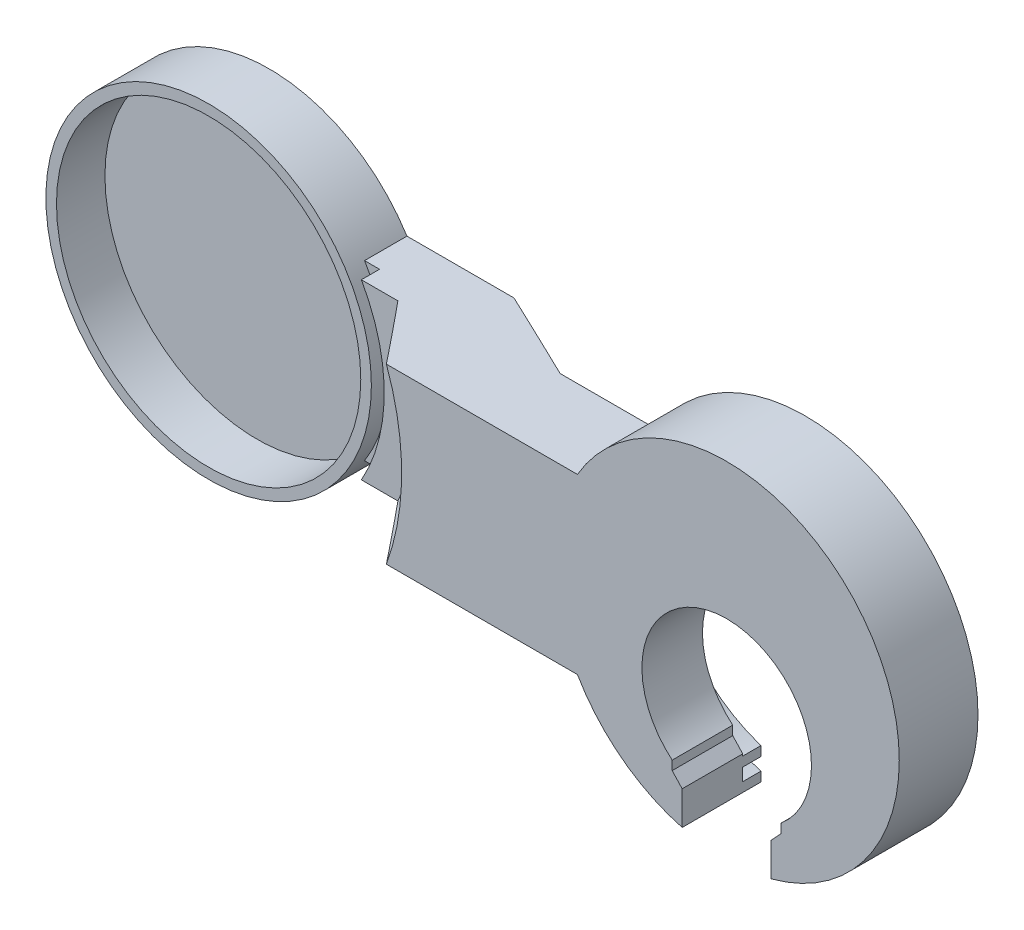
ISO-10303-21;
HEADER;
FILE_DESCRIPTION(('STEP AP214'),'2;1');
FILE_NAME('part.step','',(''),(''),'','','');
FILE_SCHEMA(('AUTOMOTIVE_DESIGN { 1 0 10303 214 1 1 1 1 }'));
ENDSEC;
DATA;
#1=APPLICATION_CONTEXT('core data for automotive mechanical design processes');
#2=APPLICATION_PROTOCOL_DEFINITION('international standard','automotive_design',2000,#1);
#3=PRODUCT_CONTEXT('',#1,'mechanical');
#4=PRODUCT('Part','Part','',(#3));
#5=PRODUCT_RELATED_PRODUCT_CATEGORY('part','',(#4));
#6=PRODUCT_DEFINITION_FORMATION('','',#4);
#7=PRODUCT_DEFINITION_CONTEXT('part definition',#1,'design');
#8=PRODUCT_DEFINITION('design','',#6,#7);
#9=PRODUCT_DEFINITION_SHAPE('','',#8);
#10=(LENGTH_UNIT() NAMED_UNIT(*) SI_UNIT(.MILLI.,.METRE.));
#11=(NAMED_UNIT(*) PLANE_ANGLE_UNIT() SI_UNIT($,.RADIAN.));
#12=(NAMED_UNIT(*) SI_UNIT($,.STERADIAN.) SOLID_ANGLE_UNIT());
#13=UNCERTAINTY_MEASURE_WITH_UNIT(LENGTH_MEASURE(1.E-05),#10,'distance_accuracy_value','');
#14=(GEOMETRIC_REPRESENTATION_CONTEXT(3) GLOBAL_UNCERTAINTY_ASSIGNED_CONTEXT((#13)) GLOBAL_UNIT_ASSIGNED_CONTEXT((#10,
#11,#12)) REPRESENTATION_CONTEXT('',''));
#15=CARTESIAN_POINT('',(0.,0.,0.));
#16=DIRECTION('',(0.,0.,1.));
#17=DIRECTION('',(1.,0.,0.));
#18=AXIS2_PLACEMENT_3D('',#15,#16,#17);
#19=CARTESIAN_POINT('',(0.,0.,10.));
#20=DIRECTION('',(0.,0.,1.));
#21=DIRECTION('',(1.,0.,0.));
#22=AXIS2_PLACEMENT_3D('',#19,#20,#21);
#23=PLANE('',#22);
#24=CARTESIAN_POINT('',(0.,0.,10.));
#25=DIRECTION('',(0.,0.,1.));
#26=DIRECTION('',(1.,0.,0.));
#27=AXIS2_PLACEMENT_3D('',#24,#25,#26);
#28=CIRCLE('',#27,25.125);
#29=CARTESIAN_POINT('',(25.125,0.,10.));
#30=VERTEX_POINT('',#29);
#31=EDGE_CURVE('E354',#30,#30,#28,.T.);
#32=ORIENTED_EDGE('',*,*,#31,.F.);
#33=EDGE_LOOP('',(#32));
#34=FACE_BOUND('',#33,.T.);
#35=CARTESIAN_POINT('',(0.,0.,10.));
#36=DIRECTION('',(0.,0.,1.));
#37=DIRECTION('',(1.,0.,0.));
#38=AXIS2_PLACEMENT_3D('',#35,#36,#37);
#39=CIRCLE('',#38,26.875);
#40=CARTESIAN_POINT('',(26.875,0.,10.));
#41=VERTEX_POINT('',#40);
#42=EDGE_CURVE('E357',#41,#41,#39,.T.);
#43=ORIENTED_EDGE('',*,*,#42,.T.);
#44=EDGE_LOOP('',(#43));
#45=FACE_BOUND('',#44,.T.);
#46=ADVANCED_FACE('F46',(#34,#45),#23,.T.);
#47=CARTESIAN_POINT('',(95.5491497411514,0.,7.));
#48=DIRECTION('',(0.,0.,1.));
#49=DIRECTION('',(1.,0.,0.));
#50=AXIS2_PLACEMENT_3D('',#47,#48,#49);
#51=CYLINDRICAL_SURFACE('',#50,28.5);
#52=DIRECTION('',(0.,0.,-1.));
#53=VECTOR('',#52,1.);
#54=CARTESIAN_POINT('',(88.1991497411514,-27.5359310719649,20.));
#55=LINE('',#54,#53);
#56=CARTESIAN_POINT('',(88.1991497411514,-27.5359310719649,20.));
#57=VERTEX_POINT('',#56);
#58=CARTESIAN_POINT('',(88.1991497411514,-27.5359310719649,7.));
#59=VERTEX_POINT('',#58);
#60=EDGE_CURVE('E266',#57,#59,#55,.T.);
#61=ORIENTED_EDGE('',*,*,#60,.F.);
#62=CARTESIAN_POINT('',(95.5491497411514,0.,20.));
#63=DIRECTION('',(0.,0.,1.));
#64=DIRECTION('',(1.,0.,0.));
#65=AXIS2_PLACEMENT_3D('',#62,#63,#64);
#66=CIRCLE('',#65,28.5);
#67=CARTESIAN_POINT('',(70.9021428168184,-14.3099633008573,20.));
#68=VERTEX_POINT('',#67);
#69=EDGE_CURVE('E329',#68,#57,#66,.T.);
#70=ORIENTED_EDGE('',*,*,#69,.F.);
#71=DIRECTION('',(0.,0.,1.));
#72=VECTOR('',#71,1.);
#73=CARTESIAN_POINT('',(70.9021428168184,-14.3099633008573,7.));
#74=LINE('',#73,#72);
#75=CARTESIAN_POINT('',(70.9021428168184,-14.3099633008573,7.));
#76=VERTEX_POINT('',#75);
#77=EDGE_CURVE('E336',#76,#68,#74,.T.);
#78=ORIENTED_EDGE('',*,*,#77,.F.);
#79=CARTESIAN_POINT('',(95.5491497411514,0.,7.));
#80=DIRECTION('',(0.,0.,1.));
#81=DIRECTION('',(1.,0.,0.));
#82=AXIS2_PLACEMENT_3D('',#79,#80,#81);
#83=CIRCLE('',#82,28.5);
#84=EDGE_CURVE('E333',#76,#59,#83,.T.);
#85=ORIENTED_EDGE('',*,*,#84,.T.);
#86=EDGE_LOOP('',(#61,#70,#78,#85));
#87=FACE_BOUND('',#86,.T.);
#88=ADVANCED_FACE('F457',(#87),#51,.T.);
#89=CARTESIAN_POINT('',(0.,0.,2.));
#90=DIRECTION('',(0.,0.,-1.));
#91=DIRECTION('',(-1.,0.,0.));
#92=AXIS2_PLACEMENT_3D('',#89,#90,#91);
#93=CYLINDRICAL_SURFACE('',#92,26.875);
#94=ORIENTED_EDGE('',*,*,#42,.F.);
#95=EDGE_LOOP('',(#94));
#96=FACE_BOUND('',#95,.T.);
#97=CARTESIAN_POINT('',(0.,0.,0.));
#98=DIRECTION('',(0.,0.,1.));
#99=DIRECTION('',(1.,0.,0.));
#100=AXIS2_PLACEMENT_3D('',#97,#98,#99);
#101=CIRCLE('',#100,26.875);
#102=CARTESIAN_POINT('',(22.7484191830579,14.3099633008573,0.));
#103=VERTEX_POINT('',#102);
#104=CARTESIAN_POINT('',(22.7484191830579,-14.3099633008573,0.));
#105=VERTEX_POINT('',#104);
#106=EDGE_CURVE('E360',#103,#105,#101,.T.);
#107=ORIENTED_EDGE('',*,*,#106,.T.);
#108=DIRECTION('',(0.,0.,1.));
#109=VECTOR('',#108,1.);
#110=CARTESIAN_POINT('',(22.7484191830579,-14.3099633008573,7.));
#111=LINE('',#110,#109);
#112=CARTESIAN_POINT('',(22.7484191830579,-14.3099633008573,7.));
#113=VERTEX_POINT('',#112);
#114=EDGE_CURVE('E352',#105,#113,#111,.T.);
#115=ORIENTED_EDGE('',*,*,#114,.T.);
#116=CARTESIAN_POINT('',(0.,0.,7.));
#117=DIRECTION('',(0.,0.,1.));
#118=DIRECTION('',(1.,0.,0.));
#119=AXIS2_PLACEMENT_3D('',#116,#117,#118);
#120=CIRCLE('',#119,26.875);
#121=CARTESIAN_POINT('',(22.7484191830579,14.3099633008573,7.));
#122=VERTEX_POINT('',#121);
#123=EDGE_CURVE('E221',#113,#122,#120,.T.);
#124=ORIENTED_EDGE('',*,*,#123,.T.);
#125=DIRECTION('',(0.,0.,1.));
#126=VECTOR('',#125,1.);
#127=CARTESIAN_POINT('',(22.7484191830579,14.3099633008573,7.));
#128=LINE('',#127,#126);
#129=EDGE_CURVE('E349',#103,#122,#128,.T.);
#130=ORIENTED_EDGE('',*,*,#129,.F.);
#131=EDGE_LOOP('',(#107,#115,#124,#130));
#132=FACE_BOUND('',#131,.T.);
#133=ADVANCED_FACE('F530',(#96,#132),#93,.T.);
#134=CARTESIAN_POINT('',(0.,0.,0.));
#135=DIRECTION('',(0.,0.,1.));
#136=DIRECTION('',(1.,0.,0.));
#137=AXIS2_PLACEMENT_3D('',#134,#135,#136);
#138=PLANE('',#137);
#139=ORIENTED_EDGE('',*,*,#106,.F.);
#140=DIRECTION('',(1.,0.,0.));
#141=VECTOR('',#140,1.);
#142=CARTESIAN_POINT('',(70.9021428168184,14.3099633008573,0.));
#143=LINE('',#142,#141);
#144=CARTESIAN_POINT('',(40.4164641616277,14.3099633008573,0.));
#145=VERTEX_POINT('',#144);
#146=EDGE_CURVE('E52',#103,#145,#143,.T.);
#147=ORIENTED_EDGE('',*,*,#146,.T.);
#148=CARTESIAN_POINT('',(0.,0.,0.));
#149=DIRECTION('',(0.,0.,1.));
#150=DIRECTION('',(1.,0.,0.));
#151=AXIS2_PLACEMENT_3D('',#148,#149,#150);
#152=CIRCLE('',#151,42.8750000000002);
#153=CARTESIAN_POINT('',(40.4164641616277,-14.3099633008573,0.));
#154=VERTEX_POINT('',#153);
#155=EDGE_CURVE('E71',#145,#154,#152,.F.);
#156=ORIENTED_EDGE('',*,*,#155,.T.);
#157=DIRECTION('',(-1.,0.,0.));
#158=VECTOR('',#157,1.);
#159=CARTESIAN_POINT('',(0.,-14.3099633008573,0.));
#160=LINE('',#159,#158);
#161=EDGE_CURVE('E12',#105,#154,#160,.F.);
#162=ORIENTED_EDGE('',*,*,#161,.F.);
#163=EDGE_LOOP('',(#139,#147,#156,#162));
#164=FACE_BOUND('',#163,.T.);
#165=ADVANCED_FACE('F409',(#164),#138,.F.);
#166=CARTESIAN_POINT('',(0.,0.,10.));
#167=DIRECTION('',(0.,0.,1.));
#168=DIRECTION('',(1.,0.,0.));
#169=AXIS2_PLACEMENT_3D('',#166,#167,#168);
#170=CIRCLE('',#169,29.);
#171=CARTESIAN_POINT('',(25.2234999619029,-14.3099633008573,10.));
#172=VERTEX_POINT('',#171);
#173=CARTESIAN_POINT('',(25.2234999619029,14.3099633008573,10.));
#174=VERTEX_POINT('',#173);
#175=EDGE_CURVE('E224',#172,#174,#170,.T.);
#176=ORIENTED_EDGE('',*,*,#175,.F.);
#177=DIRECTION('',(-1.,0.,0.));
#178=VECTOR('',#177,1.);
#179=CARTESIAN_POINT('',(0.,-14.3099633008573,10.));
#180=LINE('',#179,#178);
#181=CARTESIAN_POINT('',(31.2548488290717,-14.3099633008573,10.));
#182=VERTEX_POINT('',#181);
#183=EDGE_CURVE('E229',#182,#172,#180,.T.);
#184=ORIENTED_EDGE('',*,*,#183,.F.);
#185=CARTESIAN_POINT('',(0.,0.,10.));
#186=DIRECTION('',(0.,0.,1.));
#187=DIRECTION('',(1.,0.,0.));
#188=AXIS2_PLACEMENT_3D('',#185,#186,#187);
#189=CIRCLE('',#188,34.3750000000001);
#190=CARTESIAN_POINT('',(31.2548488290717,14.3099633008573,10.));
#191=VERTEX_POINT('',#190);
#192=EDGE_CURVE('E433',#182,#191,#189,.T.);
#193=ORIENTED_EDGE('',*,*,#192,.T.);
#194=DIRECTION('',(1.,0.,0.));
#195=VECTOR('',#194,1.);
#196=CARTESIAN_POINT('',(70.9021428168184,14.3099633008573,10.));
#197=LINE('',#196,#195);
#198=EDGE_CURVE('E436',#174,#191,#197,.T.);
#199=ORIENTED_EDGE('',*,*,#198,.F.);
#200=EDGE_LOOP('',(#176,#184,#193,#199));
#201=FACE_BOUND('',#200,.T.);
#202=ADVANCED_FACE('F526',(#201),#23,.T.);
#203=CARTESIAN_POINT('',(0.,0.,10.));
#204=DIRECTION('',(0.,0.,-1.));
#205=DIRECTION('',(-1.,0.,0.));
#206=AXIS2_PLACEMENT_3D('',#203,#204,#205);
#207=CYLINDRICAL_SURFACE('',#206,25.125);
#208=ORIENTED_EDGE('',*,*,#31,.T.);
#209=EDGE_LOOP('',(#208));
#210=FACE_BOUND('',#209,.T.);
#211=CARTESIAN_POINT('',(0.,0.,2.));
#212=DIRECTION('',(0.,0.,1.));
#213=DIRECTION('',(1.,0.,0.));
#214=AXIS2_PLACEMENT_3D('',#211,#212,#213);
#215=CIRCLE('',#214,25.125);
#216=CARTESIAN_POINT('',(25.125,0.,2.));
#217=VERTEX_POINT('',#216);
#218=EDGE_CURVE('E363',#217,#217,#215,.F.);
#219=ORIENTED_EDGE('',*,*,#218,.T.);
#220=EDGE_LOOP('',(#219));
#221=FACE_BOUND('',#220,.T.);
#222=ADVANCED_FACE('F389',(#210,#221),#207,.F.);
#223=CARTESIAN_POINT('',(0.,0.,2.));
#224=DIRECTION('',(0.,0.,1.));
#225=DIRECTION('',(1.,0.,0.));
#226=AXIS2_PLACEMENT_3D('',#223,#224,#225);
#227=PLANE('',#226);
#228=ORIENTED_EDGE('',*,*,#218,.F.);
#229=EDGE_LOOP('',(#228));
#230=FACE_BOUND('',#229,.T.);
#231=ADVANCED_FACE('F386',(#230),#227,.T.);
#232=CARTESIAN_POINT('',(70.9021428168184,-14.3099633008573,7.));
#233=DIRECTION('',(0.,1.,0.));
#234=DIRECTION('',(-1.,0.,0.));
#235=AXIS2_PLACEMENT_3D('',#232,#233,#234);
#236=PLANE('',#235);
#237=ORIENTED_EDGE('',*,*,#183,.T.);
#238=DIRECTION('',(0.,0.,1.));
#239=VECTOR('',#238,1.);
#240=CARTESIAN_POINT('',(25.2234999619029,-14.3099633008573,7.));
#241=LINE('',#240,#239);
#242=CARTESIAN_POINT('',(25.2234999619029,-14.3099633008573,7.));
#243=VERTEX_POINT('',#242);
#244=EDGE_CURVE('E211',#243,#172,#241,.T.);
#245=ORIENTED_EDGE('',*,*,#244,.F.);
#246=DIRECTION('',(1.,0.,0.));
#247=VECTOR('',#246,1.);
#248=CARTESIAN_POINT('',(0.,-14.3099633008573,7.));
#249=LINE('',#248,#247);
#250=EDGE_CURVE('E217',#113,#243,#249,.T.);
#251=ORIENTED_EDGE('',*,*,#250,.F.);
#252=ORIENTED_EDGE('',*,*,#114,.F.);
#253=ORIENTED_EDGE('',*,*,#161,.T.);
#254=CARTESIAN_POINT('',(22.7484191830579,-14.3099633008573,-8.00000000000021));
#255=CARTESIAN_POINT('',(23.2931688216632,-14.3099633008573,-7.76942524856581));
#256=CARTESIAN_POINT('',(23.8370881150449,-14.3099633008573,-7.5368988022653));
#257=CARTESIAN_POINT('',(24.9234588988973,-14.3099633008573,-7.0684569490064));
#258=CARTESIAN_POINT('',(25.4659104054992,-14.3099633008573,-6.83254157947434));
#259=CARTESIAN_POINT('',(26.549527642955,-14.3099633008573,-6.35784121796449));
#260=CARTESIAN_POINT('',(27.0906934271248,-14.3099633008573,-6.11905634755649));
#261=CARTESIAN_POINT('',(28.1719220644972,-14.3099633008573,-5.63899943525557));
#262=CARTESIAN_POINT('',(28.7119849141987,-14.3099633008573,-5.39772738548191));
#263=CARTESIAN_POINT('',(30.330619238033,-14.3099633008573,-4.67074713629139));
#264=CARTESIAN_POINT('',(31.4077478829394,-14.3099633008573,-4.18182586477595));
#265=CARTESIAN_POINT('',(33.5590309628089,-14.3099633008573,-3.19746118184968));
#266=CARTESIAN_POINT('',(34.6331853600071,-14.3099633008573,-2.70201768807957));
#267=CARTESIAN_POINT('',(36.7789779052465,-14.3099633008573,-1.70612235140349));
#268=CARTESIAN_POINT('',(37.8506163972555,-14.3099633008573,-1.20567124908914));
#269=CARTESIAN_POINT('',(39.9919989156063,-14.3099633008573,-0.200747398782867));
#270=CARTESIAN_POINT('',(41.0617429500997,-14.3099633008573,0.303725331852886));
#271=CARTESIAN_POINT('',(43.1997217386016,-14.3099633008573,1.31592218272281));
#272=CARTESIAN_POINT('',(44.2679564564281,-14.3099633008573,1.82364637934094));
#273=CARTESIAN_POINT('',(46.4031658905237,-14.3099633008573,2.84173810149619));
#274=CARTESIAN_POINT('',(47.47014060601,-14.3099633008573,3.3521056286749));
#275=CARTESIAN_POINT('',(49.079465590941,-14.3099633008573,4.12392359823363));
#276=CARTESIAN_POINT('',(49.6222043222016,-14.3099633008573,4.38456456231667));
#277=CARTESIAN_POINT('',(50.7074296415188,-14.3099633008573,4.90636217626705));
#278=CARTESIAN_POINT('',(51.2499162311441,-14.3099633008573,5.16751882287138));
#279=CARTESIAN_POINT('',(52.3346795169204,-14.3099633008573,5.69031256158584));
#280=CARTESIAN_POINT('',(52.8769562056906,-14.3099633008573,5.95194966900834));
#281=CARTESIAN_POINT('',(53.9613038124597,-14.3099633008573,6.47565877397903));
#282=CARTESIAN_POINT('',(54.5033747291247,-14.3099633008573,6.73773077428893));
#283=CARTESIAN_POINT('',(55.0453501699111,-14.3099633008573,7.));
#284=B_SPLINE_CURVE_WITH_KNOTS('',3,(#254,#255,#256,#257,#258,#259,#260,#261,#262,#263,#264,
#265,#266,#267,#268,#269,#270,#271,#272,#273,#274,#275,#276,#277,#278,#279,#280,#281,#282,#283),
.UNSPECIFIED.,.F.,.F.,(4,2,2,2,2,2,2,2,2,2,2,2,2,2,4),(0.,1.77460369200208,3.54918780082176,
5.32369699049992,7.09821180451367,10.6468763877609,14.1955858247862,17.7437779685368,
21.2919548076021,24.8402153090328,28.3884780143063,30.1947146021795,32.0009397973675,
33.8072235925301,35.6135189024584),.UNSPECIFIED.);
#285=CARTESIAN_POINT('',(55.0453501699111,-14.3099633008573,7.));
#286=VERTEX_POINT('',#285);
#287=EDGE_CURVE('E393',#154,#286,#284,.T.);
#288=ORIENTED_EDGE('',*,*,#287,.T.);
#289=DIRECTION('',(-1.,0.,0.));
#290=VECTOR('',#289,1.);
#291=CARTESIAN_POINT('',(70.9021428168184,-14.3099633008573,7.));
#292=LINE('',#291,#290);
#293=EDGE_CURVE('E325',#76,#286,#292,.T.);
#294=ORIENTED_EDGE('',*,*,#293,.F.);
#295=ORIENTED_EDGE('',*,*,#77,.T.);
#296=DIRECTION('',(-1.,0.,0.));
#297=VECTOR('',#296,1.);
#298=CARTESIAN_POINT('',(70.9021428168184,-14.3099633008573,20.));
#299=LINE('',#298,#297);
#300=CARTESIAN_POINT('',(39.3540414103574,-14.3099633008573,20.));
#301=VERTEX_POINT('',#300);
#302=EDGE_CURVE('E322',#68,#301,#299,.T.);
#303=ORIENTED_EDGE('',*,*,#302,.T.);
#304=CARTESIAN_POINT('',(39.3540414103574,-14.3099633008573,20.));
#305=CARTESIAN_POINT('',(38.918200396022,-14.3099633008573,19.4538669715759));
#306=CARTESIAN_POINT('',(38.4818466587863,-14.3099633008573,18.9081430980953));
#307=CARTESIAN_POINT('',(37.6080013020913,-14.3099633008573,17.8176062175523));
#308=CARTESIAN_POINT('',(37.1705096813851,-14.3099633008573,17.2727932114891));
#309=CARTESIAN_POINT('',(35.8561915050752,-14.3099633008573,15.6398993044533));
#310=CARTESIAN_POINT('',(34.9774910794101,-14.3099633008573,14.553325193687));
#311=CARTESIAN_POINT('',(33.2139466652834,-14.3099633008573,12.3851455345182));
#312=CARTESIAN_POINT('',(32.329102599535,-14.3099633008573,11.3035400489064));
#313=CARTESIAN_POINT('',(30.9960731395238,-14.3099633008573,9.68585046843278));
#314=CARTESIAN_POINT('',(30.5507617427346,-14.3099633008573,9.14739785954176));
#315=CARTESIAN_POINT('',(29.6579675153371,-14.3099633008573,8.07229265777269));
#316=CARTESIAN_POINT('',(29.2104846763867,-14.3099633008573,7.53564007182325));
#317=CARTESIAN_POINT('',(28.7617901968588,-14.3099633008573,7.));
#318=B_SPLINE_CURVE_WITH_KNOTS('',3,(#304,#305,#306,#307,#308,#309,#310,#311,#312,#313,#314,
#315,#316,#317),.UNSPECIFIED.,.F.,.F.,(4,2,2,2,2,2,4),(0.,2.09617895840916,4.19236021476432,
8.38457569338142,12.5768440058506,14.6730500323726,16.7692641183333),.UNSPECIFIED.);
#319=EDGE_CURVE('E369',#301,#182,#318,.T.);
#320=ORIENTED_EDGE('',*,*,#319,.T.);
#321=EDGE_LOOP('',(#237,#245,#251,#252,#253,#288,#294,#295,#303,#320));
#322=FACE_BOUND('',#321,.T.);
#323=ADVANCED_FACE('F227',(#322),#236,.F.);
#324=CARTESIAN_POINT('',(70.9021428168184,14.3099633008573,7.));
#325=DIRECTION('',(0.,1.,0.));
#326=DIRECTION('',(-1.,0.,0.));
#327=AXIS2_PLACEMENT_3D('',#324,#325,#326);
#328=PLANE('',#327);
#329=DIRECTION('',(0.,0.,1.));
#330=VECTOR('',#329,1.);
#331=CARTESIAN_POINT('',(25.2234999619029,14.3099633008573,7.));
#332=LINE('',#331,#330);
#333=CARTESIAN_POINT('',(25.2234999619029,14.3099633008573,7.));
#334=VERTEX_POINT('',#333);
#335=EDGE_CURVE('E214',#334,#174,#332,.T.);
#336=ORIENTED_EDGE('',*,*,#335,.T.);
#337=ORIENTED_EDGE('',*,*,#198,.T.);
#338=CARTESIAN_POINT('',(28.7617901968588,14.3099633008573,7.));
#339=CARTESIAN_POINT('',(29.2104846763867,14.3099633008573,7.53564007182325));
#340=CARTESIAN_POINT('',(29.6579675153371,14.3099633008573,8.07229265777269));
#341=CARTESIAN_POINT('',(30.5507617427346,14.3099633008573,9.14739785954176));
#342=CARTESIAN_POINT('',(30.9960731395238,14.3099633008573,9.68585046843278));
#343=CARTESIAN_POINT('',(32.3291025995349,14.3099633008573,11.3035400489064));
#344=CARTESIAN_POINT('',(33.2139466652834,14.3099633008573,12.3851455345182));
#345=CARTESIAN_POINT('',(34.9774910794101,14.3099633008573,14.553325193687));
#346=CARTESIAN_POINT('',(35.8561915050752,14.3099633008573,15.6398993044533));
#347=CARTESIAN_POINT('',(37.1705096813851,14.3099633008573,17.2727932114892));
#348=CARTESIAN_POINT('',(37.6080013020913,14.3099633008573,17.8176062175523));
#349=CARTESIAN_POINT('',(38.4818466587863,14.3099633008573,18.9081430980953));
#350=CARTESIAN_POINT('',(38.918200396022,14.3099633008573,19.453866971576));
#351=CARTESIAN_POINT('',(39.3540414103574,14.3099633008573,20.));
#352=B_SPLINE_CURVE_WITH_KNOTS('',3,(#338,#339,#340,#341,#342,#343,#344,#345,#346,#347,#348,
#349,#350,#351),.UNSPECIFIED.,.F.,.F.,(4,2,2,2,2,2,4),(0.,2.09621408596067,4.19242011248274,
8.38468842495187,12.576903903569,14.6730851599241,16.7692641183333),.UNSPECIFIED.);
#353=CARTESIAN_POINT('',(39.3540414103574,14.3099633008573,20.));
#354=VERTEX_POINT('',#353);
#355=EDGE_CURVE('E437',#191,#354,#352,.T.);
#356=ORIENTED_EDGE('',*,*,#355,.T.);
#357=DIRECTION('',(-1.,0.,0.));
#358=VECTOR('',#357,1.);
#359=CARTESIAN_POINT('',(70.9021428168184,14.3099633008573,20.));
#360=LINE('',#359,#358);
#361=CARTESIAN_POINT('',(70.9021428168184,14.3099633008573,20.));
#362=VERTEX_POINT('',#361);
#363=EDGE_CURVE('E339',#362,#354,#360,.T.);
#364=ORIENTED_EDGE('',*,*,#363,.F.);
#365=DIRECTION('',(0.,0.,1.));
#366=VECTOR('',#365,1.);
#367=CARTESIAN_POINT('',(70.9021428168184,14.3099633008573,7.));
#368=LINE('',#367,#366);
#369=CARTESIAN_POINT('',(70.9021428168184,14.3099633008573,7.));
#370=VERTEX_POINT('',#369);
#371=EDGE_CURVE('E346',#370,#362,#368,.T.);
#372=ORIENTED_EDGE('',*,*,#371,.F.);
#373=DIRECTION('',(-1.,0.,0.));
#374=VECTOR('',#373,1.);
#375=CARTESIAN_POINT('',(70.9021428168184,14.3099633008573,7.));
#376=LINE('',#375,#374);
#377=CARTESIAN_POINT('',(55.0453501699111,14.3099633008573,7.));
#378=VERTEX_POINT('',#377);
#379=EDGE_CURVE('E328',#370,#378,#376,.T.);
#380=ORIENTED_EDGE('',*,*,#379,.T.);
#381=CARTESIAN_POINT('',(55.0453501699111,14.3099633008573,7.));
#382=CARTESIAN_POINT('',(53.7096242638324,14.3099633008573,6.35366469664285));
#383=CARTESIAN_POINT('',(52.373344674416,14.3099633008573,5.7084693043036));
#384=CARTESIAN_POINT('',(49.6993404675902,14.3099633008573,4.42109005335672));
#385=CARTESIAN_POINT('',(48.3616158541539,14.3099633008573,3.77890618649449));
#386=CARTESIAN_POINT('',(45.6845406500232,14.3099633008573,2.49835660927061));
#387=CARTESIAN_POINT('',(44.3451902786643,14.3099633008573,1.8599904406735));
#388=CARTESIAN_POINT('',(41.6641986291977,14.3099633008573,0.588058825084401));
#389=CARTESIAN_POINT('',(40.3225573353683,14.3099633008573,-0.0455065887983191));
#390=CARTESIAN_POINT('',(37.6361495167242,14.3099633008573,-1.30642701218183));
#391=CARTESIAN_POINT('',(36.2913826170486,14.3099633008573,-1.93378122366719));
#392=CARTESIAN_POINT('',(33.5979667249995,14.3099633008573,-3.18005701546443));
#393=CARTESIAN_POINT('',(32.2493178038109,14.3099633008573,-3.79897874922512));
#394=CARTESIAN_POINT('',(30.2222792758602,14.3099633008573,-4.71863941247907));
#395=CARTESIAN_POINT('',(29.5458773880585,14.3099633008573,-5.0237591949897));
#396=CARTESIAN_POINT('',(28.1915071843088,14.3099633008573,-5.63049525208813));
#397=CARTESIAN_POINT('',(27.5135388765634,14.3099633008573,-5.93211154497256));
#398=CARTESIAN_POINT('',(26.1557117746274,14.3099633008573,-6.531177453783));
#399=CARTESIAN_POINT('',(25.4758528685187,14.3099633008573,-6.82862681646225));
#400=CARTESIAN_POINT('',(24.1139012875217,14.3099633008573,-7.41839772250544));
#401=CARTESIAN_POINT('',(23.4318085724073,14.3099633008573,-7.71071917291734));
#402=CARTESIAN_POINT('',(22.7484191830579,14.3099633008573,-8.00000000000021));
#403=B_SPLINE_CURVE_WITH_KNOTS('',3,(#381,#382,#383,#384,#385,#386,#387,#388,#389,#390,#391,
#392,#393,#394,#395,#396,#397,#398,#399,#400,#401,#402),.UNSPECIFIED.,.F.,.F.,(4,2,2,2,2,2,2,2,
2,2,4),(0.,4.45165561746435,8.90329902580481,13.3543969277941,17.8055254996947,22.2572187189001,
26.7088308205643,28.9349312441426,31.1610200368949,33.3872435391721,35.6135073538883),.UNSPECIFIED.);
#404=EDGE_CURVE('E400',#378,#145,#403,.T.);
#405=ORIENTED_EDGE('',*,*,#404,.T.);
#406=ORIENTED_EDGE('',*,*,#146,.F.);
#407=ORIENTED_EDGE('',*,*,#129,.T.);
#408=DIRECTION('',(-1.,0.,0.));
#409=VECTOR('',#408,1.);
#410=CARTESIAN_POINT('',(0.,14.3099633008573,7.));
#411=LINE('',#410,#409);
#412=EDGE_CURVE('E216',#334,#122,#411,.T.);
#413=ORIENTED_EDGE('',*,*,#412,.F.);
#414=EDGE_LOOP('',(#336,#337,#356,#364,#372,#380,#405,#406,#407,#413));
#415=FACE_BOUND('',#414,.T.);
#416=ADVANCED_FACE('F385',(#415),#328,.T.);
#417=DIRECTION('',(0.,0.,-1.));
#418=VECTOR('',#417,1.);
#419=CARTESIAN_POINT('',(102.899149741151,-27.5359310719649,20.));
#420=LINE('',#419,#418);
#421=CARTESIAN_POINT('',(102.899149741151,-27.5359310719649,20.));
#422=VERTEX_POINT('',#421);
#423=CARTESIAN_POINT('',(102.899149741151,-27.5359310719649,7.));
#424=VERTEX_POINT('',#423);
#425=EDGE_CURVE('E268',#422,#424,#420,.T.);
#426=ORIENTED_EDGE('',*,*,#425,.T.);
#427=EDGE_CURVE('E332',#424,#370,#83,.T.);
#428=ORIENTED_EDGE('',*,*,#427,.T.);
#429=ORIENTED_EDGE('',*,*,#371,.T.);
#430=EDGE_CURVE('E342',#422,#362,#66,.T.);
#431=ORIENTED_EDGE('',*,*,#430,.F.);
#432=EDGE_LOOP('',(#426,#428,#429,#431));
#433=FACE_BOUND('',#432,.T.);
#434=ADVANCED_FACE('F514',(#433),#51,.T.);
#435=CARTESIAN_POINT('',(0.,0.,7.));
#436=DIRECTION('',(0.,0.,-1.));
#437=DIRECTION('',(-1.,0.,0.));
#438=AXIS2_PLACEMENT_3D('',#435,#436,#437);
#439=PLANE('',#438);
#440=ORIENTED_EDGE('',*,*,#293,.T.);
#441=CARTESIAN_POINT('',(0.,0.,7.));
#442=DIRECTION('',(0.,0.,-1.));
#443=DIRECTION('',(-1.,0.,0.));
#444=AXIS2_PLACEMENT_3D('',#441,#442,#443);
#445=CIRCLE('',#444,56.8750000000001);
#446=EDGE_CURVE('E414',#286,#378,#445,.F.);
#447=ORIENTED_EDGE('',*,*,#446,.T.);
#448=ORIENTED_EDGE('',*,*,#379,.F.);
#449=ORIENTED_EDGE('',*,*,#427,.F.);
#450=DIRECTION('',(0.,-1.,0.));
#451=VECTOR('',#450,1.);
#452=CARTESIAN_POINT('',(102.899149741151,0.,7.));
#453=LINE('',#452,#451);
#454=CARTESIAN_POINT('',(102.899149741151,-25.9803290972228,7.));
#455=VERTEX_POINT('',#454);
#456=EDGE_CURVE('E290',#455,#424,#453,.T.);
#457=ORIENTED_EDGE('',*,*,#456,.F.);
#458=CARTESIAN_POINT('',(95.5491497411514,0.,7.));
#459=DIRECTION('',(0.,0.,-1.));
#460=DIRECTION('',(-1.,0.,0.));
#461=AXIS2_PLACEMENT_3D('',#458,#459,#460);
#462=CIRCLE('',#461,27.);
#463=CARTESIAN_POINT('',(88.1991497411514,-25.9803290972228,7.));
#464=VERTEX_POINT('',#463);
#465=EDGE_CURVE('E311',#464,#455,#462,.T.);
#466=ORIENTED_EDGE('',*,*,#465,.F.);
#467=DIRECTION('',(0.,1.,0.));
#468=VECTOR('',#467,1.);
#469=CARTESIAN_POINT('',(88.1991497411514,0.,7.));
#470=LINE('',#469,#468);
#471=EDGE_CURVE('E304',#59,#464,#470,.T.);
#472=ORIENTED_EDGE('',*,*,#471,.F.);
#473=ORIENTED_EDGE('',*,*,#84,.F.);
#474=EDGE_LOOP('',(#440,#447,#448,#449,#457,#466,#472,#473));
#475=FACE_BOUND('',#474,.T.);
#476=ADVANCED_FACE('F463',(#475),#439,.T.);
#477=CARTESIAN_POINT('',(0.,0.,20.));
#478=DIRECTION('',(0.,0.,-1.));
#479=DIRECTION('',(-1.,0.,0.));
#480=AXIS2_PLACEMENT_3D('',#477,#478,#479);
#481=PLANE('',#480);
#482=ORIENTED_EDGE('',*,*,#69,.T.);
#483=DIRECTION('',(0.,1.,0.));
#484=VECTOR('',#483,1.);
#485=CARTESIAN_POINT('',(88.1991497411514,-27.5359310719649,20.));
#486=LINE('',#485,#484);
#487=CARTESIAN_POINT('',(88.1991497411514,-22.,20.));
#488=VERTEX_POINT('',#487);
#489=EDGE_CURVE('E247',#57,#488,#486,.T.);
#490=ORIENTED_EDGE('',*,*,#489,.T.);
#491=DIRECTION('',(-0.68060089492241,0.732654367236567,0.));
#492=VECTOR('',#491,1.);
#493=CARTESIAN_POINT('',(88.1991497411514,-22.,20.));
#494=LINE('',#493,#492);
#495=CARTESIAN_POINT('',(86.5491497411514,-20.2238052947636,20.));
#496=VERTEX_POINT('',#495);
#497=EDGE_CURVE('E250',#488,#496,#494,.T.);
#498=ORIENTED_EDGE('',*,*,#497,.T.);
#499=DIRECTION('',(0.,1.,0.));
#500=VECTOR('',#499,1.);
#501=CARTESIAN_POINT('',(86.5491497411514,-20.2238052947636,20.));
#502=LINE('',#501,#500);
#503=CARTESIAN_POINT('',(86.5491497411514,-18.7238052947636,20.));
#504=VERTEX_POINT('',#503);
#505=EDGE_CURVE('E253',#496,#504,#502,.T.);
#506=ORIENTED_EDGE('',*,*,#505,.T.);
#507=CARTESIAN_POINT('',(95.5491497411514,-8.,20.));
#508=DIRECTION('',(0.,0.,-1.));
#509=DIRECTION('',(-1.,0.,0.));
#510=AXIS2_PLACEMENT_3D('',#507,#508,#509);
#511=CIRCLE('',#510,14.);
#512=CARTESIAN_POINT('',(104.549149741151,-18.7238052947636,20.));
#513=VERTEX_POINT('',#512);
#514=EDGE_CURVE('E231',#504,#513,#511,.T.);
#515=ORIENTED_EDGE('',*,*,#514,.T.);
#516=DIRECTION('',(0.,-1.,0.));
#517=VECTOR('',#516,1.);
#518=CARTESIAN_POINT('',(104.549149741151,-18.7238052947636,20.));
#519=LINE('',#518,#517);
#520=CARTESIAN_POINT('',(104.549149741151,-20.2238052947636,20.));
#521=VERTEX_POINT('',#520);
#522=EDGE_CURVE('E238',#513,#521,#519,.T.);
#523=ORIENTED_EDGE('',*,*,#522,.T.);
#524=DIRECTION('',(-0.68060089492241,-0.732654367236567,0.));
#525=VECTOR('',#524,1.);
#526=CARTESIAN_POINT('',(104.549149741151,-20.2238052947636,20.));
#527=LINE('',#526,#525);
#528=CARTESIAN_POINT('',(102.899149741151,-22.,20.));
#529=VERTEX_POINT('',#528);
#530=EDGE_CURVE('E241',#521,#529,#527,.T.);
#531=ORIENTED_EDGE('',*,*,#530,.T.);
#532=DIRECTION('',(0.,-1.,0.));
#533=VECTOR('',#532,1.);
#534=CARTESIAN_POINT('',(102.899149741151,-22.,20.));
#535=LINE('',#534,#533);
#536=EDGE_CURVE('E244',#529,#422,#535,.T.);
#537=ORIENTED_EDGE('',*,*,#536,.T.);
#538=ORIENTED_EDGE('',*,*,#430,.T.);
#539=ORIENTED_EDGE('',*,*,#363,.T.);
#540=CARTESIAN_POINT('',(0.,0.,20.));
#541=DIRECTION('',(0.,0.,-1.));
#542=DIRECTION('',(-1.,0.,0.));
#543=AXIS2_PLACEMENT_3D('',#540,#541,#542);
#544=CIRCLE('',#543,41.8750000000002);
#545=EDGE_CURVE('E366',#354,#301,#544,.T.);
#546=ORIENTED_EDGE('',*,*,#545,.T.);
#547=ORIENTED_EDGE('',*,*,#302,.F.);
#548=EDGE_LOOP('',(#482,#490,#498,#506,#515,#523,#531,#537,#538,#539,#546,#547));
#549=FACE_BOUND('',#548,.T.);
#550=ADVANCED_FACE('F450',(#549),#481,.F.);
#551=CARTESIAN_POINT('',(0.,0.,20.));
#552=DIRECTION('',(0.,0.,1.));
#553=DIRECTION('',(1.,0.,0.));
#554=AXIS2_PLACEMENT_3D('',#551,#552,#553);
#555=CONICAL_SURFACE('',#554,41.8750000000002,0.643501108793286);
#556=ORIENTED_EDGE('',*,*,#355,.F.);
#557=ORIENTED_EDGE('',*,*,#192,.F.);
#558=ORIENTED_EDGE('',*,*,#319,.F.);
#559=ORIENTED_EDGE('',*,*,#545,.F.);
#560=EDGE_LOOP('',(#556,#557,#558,#559));
#561=FACE_BOUND('',#560,.T.);
#562=ADVANCED_FACE('F378',(#561),#555,.F.);
#563=CARTESIAN_POINT('',(95.5491497411514,0.,10.));
#564=DIRECTION('',(0.,0.,-1.));
#565=DIRECTION('',(-1.,0.,0.));
#566=AXIS2_PLACEMENT_3D('',#563,#564,#565);
#567=CYLINDRICAL_SURFACE('',#566,25.);
#568=DIRECTION('',(0.,0.,-1.));
#569=VECTOR('',#568,1.);
#570=CARTESIAN_POINT('',(88.1991497411514,-23.8951354882118,10.));
#571=LINE('',#570,#569);
#572=CARTESIAN_POINT('',(88.1991497411514,-23.8951354882118,10.));
#573=VERTEX_POINT('',#572);
#574=CARTESIAN_POINT('',(88.1991497411514,-23.8951354882118,7.));
#575=VERTEX_POINT('',#574);
#576=EDGE_CURVE('E297',#573,#575,#571,.T.);
#577=ORIENTED_EDGE('',*,*,#576,.F.);
#578=CARTESIAN_POINT('',(95.5491497411514,0.,10.));
#579=DIRECTION('',(0.,0.,-1.));
#580=DIRECTION('',(-1.,0.,0.));
#581=AXIS2_PLACEMENT_3D('',#578,#579,#580);
#582=CIRCLE('',#581,25.);
#583=CARTESIAN_POINT('',(102.899149741151,-23.8951354882118,10.));
#584=VERTEX_POINT('',#583);
#585=EDGE_CURVE('E307',#573,#584,#582,.T.);
#586=ORIENTED_EDGE('',*,*,#585,.T.);
#587=DIRECTION('',(0.,0.,-1.));
#588=VECTOR('',#587,1.);
#589=CARTESIAN_POINT('',(102.899149741151,-23.8951354882118,10.));
#590=LINE('',#589,#588);
#591=CARTESIAN_POINT('',(102.899149741151,-23.8951354882118,7.));
#592=VERTEX_POINT('',#591);
#593=EDGE_CURVE('E283',#592,#584,#590,.F.);
#594=ORIENTED_EDGE('',*,*,#593,.F.);
#595=CARTESIAN_POINT('',(95.5491497411514,0.,7.));
#596=DIRECTION('',(0.,0.,-1.));
#597=DIRECTION('',(-1.,0.,0.));
#598=AXIS2_PLACEMENT_3D('',#595,#596,#597);
#599=CIRCLE('',#598,25.);
#600=EDGE_CURVE('E306',#575,#592,#599,.T.);
#601=ORIENTED_EDGE('',*,*,#600,.F.);
#602=EDGE_LOOP('',(#577,#586,#594,#601));
#603=FACE_BOUND('',#602,.T.);
#604=ADVANCED_FACE('F477',(#603),#567,.T.);
#605=CARTESIAN_POINT('',(95.5491497411514,0.,10.));
#606=DIRECTION('',(0.,0.,-1.));
#607=DIRECTION('',(-1.,0.,0.));
#608=AXIS2_PLACEMENT_3D('',#605,#606,#607);
#609=CYLINDRICAL_SURFACE('',#608,27.);
#610=CARTESIAN_POINT('',(95.5491497411514,0.,10.));
#611=DIRECTION('',(0.,0.,-1.));
#612=DIRECTION('',(-1.,0.,0.));
#613=AXIS2_PLACEMENT_3D('',#610,#611,#612);
#614=CIRCLE('',#613,27.);
#615=CARTESIAN_POINT('',(88.1991497411514,-25.9803290972228,10.));
#616=VERTEX_POINT('',#615);
#617=CARTESIAN_POINT('',(102.899149741151,-25.9803290972228,10.));
#618=VERTEX_POINT('',#617);
#619=EDGE_CURVE('E310',#616,#618,#614,.T.);
#620=ORIENTED_EDGE('',*,*,#619,.F.);
#621=DIRECTION('',(0.,0.,-1.));
#622=VECTOR('',#621,1.);
#623=CARTESIAN_POINT('',(88.1991497411514,-25.9803290972228,10.));
#624=LINE('',#623,#622);
#625=EDGE_CURVE('E301',#616,#464,#624,.T.);
#626=ORIENTED_EDGE('',*,*,#625,.T.);
#627=ORIENTED_EDGE('',*,*,#465,.T.);
#628=DIRECTION('',(0.,0.,-1.));
#629=VECTOR('',#628,1.);
#630=CARTESIAN_POINT('',(102.899149741151,-25.9803290972228,10.));
#631=LINE('',#630,#629);
#632=EDGE_CURVE('E287',#455,#618,#631,.F.);
#633=ORIENTED_EDGE('',*,*,#632,.T.);
#634=EDGE_LOOP('',(#620,#626,#627,#633));
#635=FACE_BOUND('',#634,.T.);
#636=ADVANCED_FACE('F468',(#635),#609,.F.);
#637=CARTESIAN_POINT('',(0.,0.,10.));
#638=DIRECTION('',(0.,0.,-1.));
#639=DIRECTION('',(-1.,0.,0.));
#640=AXIS2_PLACEMENT_3D('',#637,#638,#639);
#641=PLANE('',#640);
#642=DIRECTION('',(0.,1.,0.));
#643=VECTOR('',#642,1.);
#644=CARTESIAN_POINT('',(88.1991497411514,0.,10.));
#645=LINE('',#644,#643);
#646=EDGE_CURVE('E299',#616,#573,#645,.T.);
#647=ORIENTED_EDGE('',*,*,#646,.F.);
#648=ORIENTED_EDGE('',*,*,#619,.T.);
#649=DIRECTION('',(0.,-1.,0.));
#650=VECTOR('',#649,1.);
#651=CARTESIAN_POINT('',(102.899149741151,0.,10.));
#652=LINE('',#651,#650);
#653=EDGE_CURVE('E285',#584,#618,#652,.T.);
#654=ORIENTED_EDGE('',*,*,#653,.F.);
#655=ORIENTED_EDGE('',*,*,#585,.F.);
#656=EDGE_LOOP('',(#647,#648,#654,#655));
#657=FACE_BOUND('',#656,.T.);
#658=ADVANCED_FACE('F473',(#657),#641,.T.);
#659=DIRECTION('',(0.,1.,0.));
#660=VECTOR('',#659,1.);
#661=CARTESIAN_POINT('',(88.1991497411514,0.,7.));
#662=LINE('',#661,#660);
#663=CARTESIAN_POINT('',(88.1991497411514,-22.3210102817951,7.));
#664=VERTEX_POINT('',#663);
#665=EDGE_CURVE('E295',#575,#664,#662,.T.);
#666=ORIENTED_EDGE('',*,*,#665,.F.);
#667=ORIENTED_EDGE('',*,*,#600,.T.);
#668=DIRECTION('',(0.,-1.,0.));
#669=VECTOR('',#668,1.);
#670=CARTESIAN_POINT('',(102.899149741151,0.,7.));
#671=LINE('',#670,#669);
#672=CARTESIAN_POINT('',(102.899149741151,-22.3210102817951,7.));
#673=VERTEX_POINT('',#672);
#674=EDGE_CURVE('E281',#673,#592,#671,.T.);
#675=ORIENTED_EDGE('',*,*,#674,.F.);
#676=CARTESIAN_POINT('',(95.5491497411514,0.,7.));
#677=DIRECTION('',(0.,0.,-1.));
#678=DIRECTION('',(-1.,0.,0.));
#679=AXIS2_PLACEMENT_3D('',#676,#677,#678);
#680=CIRCLE('',#679,23.5);
#681=EDGE_CURVE('E314',#664,#673,#680,.T.);
#682=ORIENTED_EDGE('',*,*,#681,.F.);
#683=EDGE_LOOP('',(#666,#667,#675,#682));
#684=FACE_BOUND('',#683,.T.);
#685=ADVANCED_FACE('F482',(#684),#439,.T.);
#686=CARTESIAN_POINT('',(95.5491497411514,0.,10.));
#687=DIRECTION('',(0.,0.,-1.));
#688=DIRECTION('',(-1.,0.,0.));
#689=AXIS2_PLACEMENT_3D('',#686,#687,#688);
#690=CYLINDRICAL_SURFACE('',#689,23.5);
#691=CARTESIAN_POINT('',(95.5491497411514,0.,10.));
#692=DIRECTION('',(0.,0.,-1.));
#693=DIRECTION('',(-1.,0.,0.));
#694=AXIS2_PLACEMENT_3D('',#691,#692,#693);
#695=CIRCLE('',#694,23.5);
#696=CARTESIAN_POINT('',(88.1991497411514,-22.3210102817951,10.));
#697=VERTEX_POINT('',#696);
#698=CARTESIAN_POINT('',(102.899149741151,-22.3210102817951,10.));
#699=VERTEX_POINT('',#698);
#700=EDGE_CURVE('E319',#697,#699,#695,.T.);
#701=ORIENTED_EDGE('',*,*,#700,.F.);
#702=DIRECTION('',(0.,0.,-1.));
#703=VECTOR('',#702,1.);
#704=CARTESIAN_POINT('',(88.1991497411514,-22.3210102817951,10.));
#705=LINE('',#704,#703);
#706=EDGE_CURVE('E292',#697,#664,#705,.T.);
#707=ORIENTED_EDGE('',*,*,#706,.T.);
#708=ORIENTED_EDGE('',*,*,#681,.T.);
#709=DIRECTION('',(0.,0.,-1.));
#710=VECTOR('',#709,1.);
#711=CARTESIAN_POINT('',(102.899149741151,-22.3210102817951,10.));
#712=LINE('',#711,#710);
#713=EDGE_CURVE('E259',#673,#699,#712,.F.);
#714=ORIENTED_EDGE('',*,*,#713,.T.);
#715=EDGE_LOOP('',(#701,#707,#708,#714));
#716=FACE_BOUND('',#715,.T.);
#717=ADVANCED_FACE('F486',(#716),#690,.F.);
#718=CARTESIAN_POINT('',(0.,0.,10.));
#719=DIRECTION('',(0.,0.,-1.));
#720=DIRECTION('',(-1.,0.,0.));
#721=AXIS2_PLACEMENT_3D('',#718,#719,#720);
#722=PLANE('',#721);
#723=DIRECTION('',(0.,1.,0.));
#724=VECTOR('',#723,1.);
#725=CARTESIAN_POINT('',(88.1991497411514,0.,10.));
#726=LINE('',#725,#724);
#727=CARTESIAN_POINT('',(88.1991497411514,-22.,10.));
#728=VERTEX_POINT('',#727);
#729=EDGE_CURVE('E415',#697,#728,#726,.T.);
#730=ORIENTED_EDGE('',*,*,#729,.F.);
#731=ORIENTED_EDGE('',*,*,#700,.T.);
#732=DIRECTION('',(0.,-1.,0.));
#733=VECTOR('',#732,1.);
#734=CARTESIAN_POINT('',(102.899149741151,0.,10.));
#735=LINE('',#734,#733);
#736=CARTESIAN_POINT('',(102.899149741151,-22.,10.));
#737=VERTEX_POINT('',#736);
#738=EDGE_CURVE('E425',#737,#699,#735,.T.);
#739=ORIENTED_EDGE('',*,*,#738,.F.);
#740=DIRECTION('',(-0.68060089492241,-0.732654367236567,0.));
#741=VECTOR('',#740,1.);
#742=CARTESIAN_POINT('',(66.2046495986073,-61.5009556754441,10.));
#743=LINE('',#742,#741);
#744=CARTESIAN_POINT('',(104.549149741151,-20.2238052947636,10.));
#745=VERTEX_POINT('',#744);
#746=EDGE_CURVE('E427',#745,#737,#743,.T.);
#747=ORIENTED_EDGE('',*,*,#746,.F.);
#748=DIRECTION('',(0.,-1.,0.));
#749=VECTOR('',#748,1.);
#750=CARTESIAN_POINT('',(104.549149741151,0.,10.));
#751=LINE('',#750,#749);
#752=CARTESIAN_POINT('',(104.549149741151,-18.7238052947636,10.));
#753=VERTEX_POINT('',#752);
#754=EDGE_CURVE('E429',#753,#745,#751,.T.);
#755=ORIENTED_EDGE('',*,*,#754,.F.);
#756=CARTESIAN_POINT('',(95.5491497411513,-8.,10.));
#757=DIRECTION('',(0.,0.,-1.));
#758=DIRECTION('',(-1.,0.,0.));
#759=AXIS2_PLACEMENT_3D('',#756,#757,#758);
#760=CIRCLE('',#759,14.);
#761=CARTESIAN_POINT('',(86.5491497411514,-18.7238052947636,10.));
#762=VERTEX_POINT('',#761);
#763=EDGE_CURVE('E431',#762,#753,#760,.T.);
#764=ORIENTED_EDGE('',*,*,#763,.F.);
#765=DIRECTION('',(0.,1.,0.));
#766=VECTOR('',#765,1.);
#767=CARTESIAN_POINT('',(86.5491497411514,0.,10.));
#768=LINE('',#767,#766);
#769=CARTESIAN_POINT('',(86.5491497411514,-20.2238052947636,10.));
#770=VERTEX_POINT('',#769);
#771=EDGE_CURVE('E422',#770,#762,#768,.T.);
#772=ORIENTED_EDGE('',*,*,#771,.F.);
#773=DIRECTION('',(-0.68060089492241,0.732654367236567,0.));
#774=VECTOR('',#773,1.);
#775=CARTESIAN_POINT('',(36.3735584052534,33.7892975312527,10.));
#776=LINE('',#775,#774);
#777=EDGE_CURVE('E418',#728,#770,#776,.T.);
#778=ORIENTED_EDGE('',*,*,#777,.F.);
#779=EDGE_LOOP('',(#730,#731,#739,#747,#755,#764,#772,#778));
#780=FACE_BOUND('',#779,.T.);
#781=ADVANCED_FACE('F490',(#780),#722,.T.);
#782=CARTESIAN_POINT('',(86.5491497411514,-20.2238052947636,20.));
#783=DIRECTION('',(-1.,0.,0.));
#784=DIRECTION('',(0.,0.,1.));
#785=AXIS2_PLACEMENT_3D('',#782,#783,#784);
#786=PLANE('',#785);
#787=ORIENTED_EDGE('',*,*,#771,.T.);
#788=DIRECTION('',(0.,0.,-1.));
#789=VECTOR('',#788,1.);
#790=CARTESIAN_POINT('',(86.5491497411514,-18.7238052947636,20.));
#791=LINE('',#790,#789);
#792=EDGE_CURVE('E257',#504,#762,#791,.T.);
#793=ORIENTED_EDGE('',*,*,#792,.F.);
#794=ORIENTED_EDGE('',*,*,#505,.F.);
#795=DIRECTION('',(0.,0.,-1.));
#796=VECTOR('',#795,1.);
#797=CARTESIAN_POINT('',(86.5491497411514,-20.2238052947636,20.));
#798=LINE('',#797,#796);
#799=EDGE_CURVE('E260',#496,#770,#798,.T.);
#800=ORIENTED_EDGE('',*,*,#799,.T.);
#801=EDGE_LOOP('',(#787,#793,#794,#800));
#802=FACE_BOUND('',#801,.T.);
#803=ADVANCED_FACE('F499',(#802),#786,.F.);
#804=CARTESIAN_POINT('',(88.1991497411514,-22.,20.));
#805=DIRECTION('',(-0.732654367236567,-0.68060089492241,0.));
#806=DIRECTION('',(0.68060089492241,-0.732654367236567,0.));
#807=AXIS2_PLACEMENT_3D('',#804,#805,#806);
#808=PLANE('',#807);
#809=ORIENTED_EDGE('',*,*,#777,.T.);
#810=ORIENTED_EDGE('',*,*,#799,.F.);
#811=ORIENTED_EDGE('',*,*,#497,.F.);
#812=DIRECTION('',(0.,0.,-1.));
#813=VECTOR('',#812,1.);
#814=CARTESIAN_POINT('',(88.1991497411514,-22.,20.));
#815=LINE('',#814,#813);
#816=EDGE_CURVE('E263',#488,#728,#815,.T.);
#817=ORIENTED_EDGE('',*,*,#816,.T.);
#818=EDGE_LOOP('',(#809,#810,#811,#817));
#819=FACE_BOUND('',#818,.T.);
#820=ADVANCED_FACE('F495',(#819),#808,.F.);
#821=CARTESIAN_POINT('',(88.1991497411514,-27.5359310719649,20.));
#822=DIRECTION('',(-1.,0.,0.));
#823=DIRECTION('',(0.,0.,1.));
#824=AXIS2_PLACEMENT_3D('',#821,#822,#823);
#825=PLANE('',#824);
#826=ORIENTED_EDGE('',*,*,#471,.T.);
#827=ORIENTED_EDGE('',*,*,#625,.F.);
#828=ORIENTED_EDGE('',*,*,#646,.T.);
#829=ORIENTED_EDGE('',*,*,#576,.T.);
#830=ORIENTED_EDGE('',*,*,#665,.T.);
#831=ORIENTED_EDGE('',*,*,#706,.F.);
#832=ORIENTED_EDGE('',*,*,#729,.T.);
#833=ORIENTED_EDGE('',*,*,#816,.F.);
#834=ORIENTED_EDGE('',*,*,#489,.F.);
#835=ORIENTED_EDGE('',*,*,#60,.T.);
#836=EDGE_LOOP('',(#826,#827,#828,#829,#830,#831,#832,#833,#834,#835));
#837=FACE_BOUND('',#836,.T.);
#838=ADVANCED_FACE('F461',(#837),#825,.F.);
#839=CARTESIAN_POINT('',(102.899149741151,-22.,20.));
#840=DIRECTION('',(1.,0.,0.));
#841=DIRECTION('',(0.,0.,-1.));
#842=AXIS2_PLACEMENT_3D('',#839,#840,#841);
#843=PLANE('',#842);
#844=ORIENTED_EDGE('',*,*,#456,.T.);
#845=ORIENTED_EDGE('',*,*,#425,.F.);
#846=ORIENTED_EDGE('',*,*,#536,.F.);
#847=DIRECTION('',(0.,0.,-1.));
#848=VECTOR('',#847,1.);
#849=CARTESIAN_POINT('',(102.899149741151,-22.,20.));
#850=LINE('',#849,#848);
#851=EDGE_CURVE('E271',#529,#737,#850,.T.);
#852=ORIENTED_EDGE('',*,*,#851,.T.);
#853=ORIENTED_EDGE('',*,*,#738,.T.);
#854=ORIENTED_EDGE('',*,*,#713,.F.);
#855=ORIENTED_EDGE('',*,*,#674,.T.);
#856=ORIENTED_EDGE('',*,*,#593,.T.);
#857=ORIENTED_EDGE('',*,*,#653,.T.);
#858=ORIENTED_EDGE('',*,*,#632,.F.);
#859=EDGE_LOOP('',(#844,#845,#846,#852,#853,#854,#855,#856,#857,#858));
#860=FACE_BOUND('',#859,.T.);
#861=ADVANCED_FACE('F515',(#860),#843,.F.);
#862=CARTESIAN_POINT('',(104.549149741151,-20.2238052947636,20.));
#863=DIRECTION('',(0.732654367236567,-0.68060089492241,0.));
#864=DIRECTION('',(0.68060089492241,0.732654367236567,0.));
#865=AXIS2_PLACEMENT_3D('',#862,#863,#864);
#866=PLANE('',#865);
#867=ORIENTED_EDGE('',*,*,#746,.T.);
#868=ORIENTED_EDGE('',*,*,#851,.F.);
#869=ORIENTED_EDGE('',*,*,#530,.F.);
#870=DIRECTION('',(0.,0.,-1.));
#871=VECTOR('',#870,1.);
#872=CARTESIAN_POINT('',(104.549149741151,-20.2238052947636,20.));
#873=LINE('',#872,#871);
#874=EDGE_CURVE('E274',#521,#745,#873,.T.);
#875=ORIENTED_EDGE('',*,*,#874,.T.);
#876=EDGE_LOOP('',(#867,#868,#869,#875));
#877=FACE_BOUND('',#876,.T.);
#878=ADVANCED_FACE('F510',(#877),#866,.F.);
#879=CARTESIAN_POINT('',(104.549149741151,-18.7238052947636,20.));
#880=DIRECTION('',(1.,0.,0.));
#881=DIRECTION('',(0.,0.,-1.));
#882=AXIS2_PLACEMENT_3D('',#879,#880,#881);
#883=PLANE('',#882);
#884=ORIENTED_EDGE('',*,*,#754,.T.);
#885=ORIENTED_EDGE('',*,*,#874,.F.);
#886=ORIENTED_EDGE('',*,*,#522,.F.);
#887=DIRECTION('',(0.,0.,-1.));
#888=VECTOR('',#887,1.);
#889=CARTESIAN_POINT('',(104.549149741151,-18.7238052947636,20.));
#890=LINE('',#889,#888);
#891=EDGE_CURVE('E256',#513,#753,#890,.T.);
#892=ORIENTED_EDGE('',*,*,#891,.T.);
#893=EDGE_LOOP('',(#884,#885,#886,#892));
#894=FACE_BOUND('',#893,.T.);
#895=ADVANCED_FACE('F506',(#894),#883,.F.);
#896=CARTESIAN_POINT('',(95.5491497411513,-8.,20.));
#897=DIRECTION('',(0.,0.,-1.));
#898=DIRECTION('',(-1.,0.,0.));
#899=AXIS2_PLACEMENT_3D('',#896,#897,#898);
#900=CYLINDRICAL_SURFACE('',#899,14.);
#901=ORIENTED_EDGE('',*,*,#763,.T.);
#902=ORIENTED_EDGE('',*,*,#891,.F.);
#903=ORIENTED_EDGE('',*,*,#514,.F.);
#904=ORIENTED_EDGE('',*,*,#792,.T.);
#905=EDGE_LOOP('',(#901,#902,#903,#904));
#906=FACE_BOUND('',#905,.T.);
#907=ADVANCED_FACE('F503',(#906),#900,.F.);
#908=CARTESIAN_POINT('',(0.,0.,-8.00000000000021));
#909=DIRECTION('',(0.,0.,1.));
#910=DIRECTION('',(1.,0.,0.));
#911=AXIS2_PLACEMENT_3D('',#908,#909,#910);
#912=CONICAL_SURFACE('',#911,26.875,1.10714871779409);
#913=ORIENTED_EDGE('',*,*,#404,.F.);
#914=ORIENTED_EDGE('',*,*,#446,.F.);
#915=ORIENTED_EDGE('',*,*,#287,.F.);
#916=ORIENTED_EDGE('',*,*,#155,.F.);
#917=EDGE_LOOP('',(#913,#914,#915,#916));
#918=FACE_BOUND('',#917,.T.);
#919=ADVANCED_FACE('F49',(#918),#912,.T.);
#920=CARTESIAN_POINT('',(0.,0.,7.));
#921=DIRECTION('',(0.,0.,1.));
#922=DIRECTION('',(1.,0.,0.));
#923=AXIS2_PLACEMENT_3D('',#920,#921,#922);
#924=CYLINDRICAL_SURFACE('',#923,29.);
#925=ORIENTED_EDGE('',*,*,#175,.T.);
#926=ORIENTED_EDGE('',*,*,#335,.F.);
#927=CARTESIAN_POINT('',(0.,0.,7.));
#928=DIRECTION('',(0.,0.,1.));
#929=DIRECTION('',(1.,0.,0.));
#930=AXIS2_PLACEMENT_3D('',#927,#928,#929);
#931=CIRCLE('',#930,29.);
#932=EDGE_CURVE('E63',#243,#334,#931,.T.);
#933=ORIENTED_EDGE('',*,*,#932,.F.);
#934=ORIENTED_EDGE('',*,*,#244,.T.);
#935=EDGE_LOOP('',(#925,#926,#933,#934));
#936=FACE_BOUND('',#935,.T.);
#937=ADVANCED_FACE('F209',(#936),#924,.F.);
#938=CARTESIAN_POINT('',(0.,0.,7.));
#939=DIRECTION('',(0.,0.,1.));
#940=DIRECTION('',(1.,0.,0.));
#941=AXIS2_PLACEMENT_3D('',#938,#939,#940);
#942=PLANE('',#941);
#943=ORIENTED_EDGE('',*,*,#250,.T.);
#944=ORIENTED_EDGE('',*,*,#932,.T.);
#945=ORIENTED_EDGE('',*,*,#412,.T.);
#946=ORIENTED_EDGE('',*,*,#123,.F.);
#947=EDGE_LOOP('',(#943,#944,#945,#946));
#948=FACE_BOUND('',#947,.T.);
#949=ADVANCED_FACE('F220',(#948),#942,.T.);
#950=CLOSED_SHELL('',(#46,#88,#133,#165,#202,#222,#231,#323,#416,#434,#476,#550,#562,#604,#636,
#658,#685,#717,#781,#803,#820,#838,#861,#878,#895,#907,#919,#937,#949));
#951=MANIFOLD_SOLID_BREP('B2',#950);
#952=ADVANCED_BREP_SHAPE_REPRESENTATION('',(#18,#951),#14);
#953=SHAPE_DEFINITION_REPRESENTATION(#9,#952);
ENDSEC;
END-ISO-10303-21;
